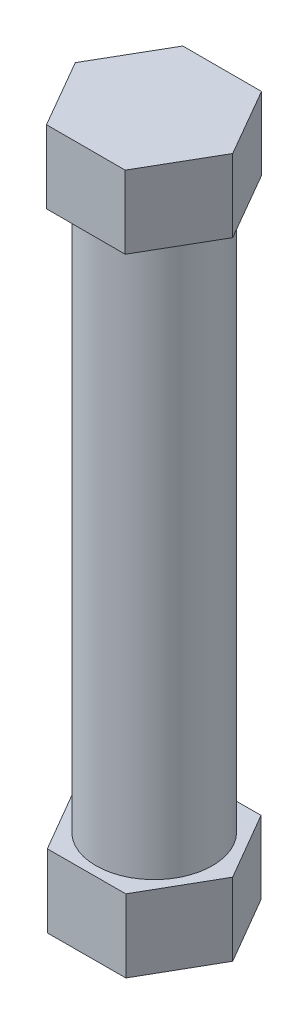
ISO-10303-21;
HEADER;
FILE_DESCRIPTION(('STEP AP214'),'2;1');
FILE_NAME('part.step','',(''),(''),'','','');
FILE_SCHEMA(('AUTOMOTIVE_DESIGN { 1 0 10303 214 1 1 1 1 }'));
ENDSEC;
DATA;
#1=APPLICATION_CONTEXT('core data for automotive mechanical design processes');
#2=APPLICATION_PROTOCOL_DEFINITION('international standard','automotive_design',2000,#1);
#3=PRODUCT_CONTEXT('',#1,'mechanical');
#4=PRODUCT('Part','Part','',(#3));
#5=PRODUCT_RELATED_PRODUCT_CATEGORY('part','',(#4));
#6=PRODUCT_DEFINITION_FORMATION('','',#4);
#7=PRODUCT_DEFINITION_CONTEXT('part definition',#1,'design');
#8=PRODUCT_DEFINITION('design','',#6,#7);
#9=PRODUCT_DEFINITION_SHAPE('','',#8);
#10=(LENGTH_UNIT() NAMED_UNIT(*) SI_UNIT(.MILLI.,.METRE.));
#11=(NAMED_UNIT(*) PLANE_ANGLE_UNIT() SI_UNIT($,.RADIAN.));
#12=(NAMED_UNIT(*) SI_UNIT($,.STERADIAN.) SOLID_ANGLE_UNIT());
#13=UNCERTAINTY_MEASURE_WITH_UNIT(LENGTH_MEASURE(1.E-05),#10,'distance_accuracy_value','');
#14=(GEOMETRIC_REPRESENTATION_CONTEXT(3) GLOBAL_UNCERTAINTY_ASSIGNED_CONTEXT((#13)) GLOBAL_UNIT_ASSIGNED_CONTEXT((#10,
#11,#12)) REPRESENTATION_CONTEXT('',''));
#15=CARTESIAN_POINT('',(0.,0.,0.));
#16=DIRECTION('',(0.,0.,1.));
#17=DIRECTION('',(1.,0.,0.));
#18=AXIS2_PLACEMENT_3D('',#15,#16,#17);
#19=CARTESIAN_POINT('',(0.,38.,0.));
#20=DIRECTION('',(0.,-1.,0.));
#21=DIRECTION('',(0.,0.,-1.));
#22=AXIS2_PLACEMENT_3D('',#19,#20,#21);
#23=CYLINDRICAL_SURFACE('',#22,4.);
#24=CARTESIAN_POINT('',(0.,38.,0.));
#25=DIRECTION('',(0.,1.,0.));
#26=DIRECTION('',(0.,0.,1.));
#27=AXIS2_PLACEMENT_3D('',#24,#25,#26);
#28=CIRCLE('',#27,4.);
#29=CARTESIAN_POINT('',(0.,38.,4.));
#30=VERTEX_POINT('',#29);
#31=EDGE_CURVE('E11',#30,#30,#28,.T.);
#32=ORIENTED_EDGE('',*,*,#31,.F.);
#33=EDGE_LOOP('',(#32));
#34=FACE_BOUND('',#33,.T.);
#35=CARTESIAN_POINT('',(0.,0.,0.));
#36=DIRECTION('',(0.,1.,0.));
#37=DIRECTION('',(0.,0.,1.));
#38=AXIS2_PLACEMENT_3D('',#35,#36,#37);
#39=CIRCLE('',#38,4.);
#40=CARTESIAN_POINT('',(0.,0.,4.));
#41=VERTEX_POINT('',#40);
#42=EDGE_CURVE('E43',#41,#41,#39,.T.);
#43=ORIENTED_EDGE('',*,*,#42,.T.);
#44=EDGE_LOOP('',(#43));
#45=FACE_BOUND('',#44,.T.);
#46=ADVANCED_FACE('F40',(#34,#45),#23,.T.);
#47=CARTESIAN_POINT('',(2.67187828013835,43.,4.66030109790377));
#48=DIRECTION('',(-0.866025403784439,0.,-0.5));
#49=DIRECTION('',(-0.5,0.,0.866025403784439));
#50=AXIS2_PLACEMENT_3D('',#47,#48,#49);
#51=PLANE('',#50);
#52=DIRECTION('',(0.5,0.,-0.866025403784439));
#53=VECTOR('',#52,1.);
#54=CARTESIAN_POINT('',(2.67187828013835,38.,4.66030109790377));
#55=LINE('',#54,#53);
#56=CARTESIAN_POINT('',(2.67187828013835,38.,4.66030109790377));
#57=VERTEX_POINT('',#56);
#58=CARTESIAN_POINT('',(5.37187828013835,38.,-0.0162360825321957));
#59=VERTEX_POINT('',#58);
#60=EDGE_CURVE('E130',#57,#59,#55,.T.);
#61=ORIENTED_EDGE('',*,*,#60,.T.);
#62=DIRECTION('',(0.,-1.,0.));
#63=VECTOR('',#62,1.);
#64=CARTESIAN_POINT('',(5.37187828013835,43.,-0.0162360825321957));
#65=LINE('',#64,#63);
#66=CARTESIAN_POINT('',(5.37187828013835,43.,-0.0162360825321957));
#67=VERTEX_POINT('',#66);
#68=EDGE_CURVE('E49',#67,#59,#65,.T.);
#69=ORIENTED_EDGE('',*,*,#68,.F.);
#70=DIRECTION('',(0.5,0.,-0.866025403784439));
#71=VECTOR('',#70,1.);
#72=CARTESIAN_POINT('',(2.67187828013835,43.,4.66030109790377));
#73=LINE('',#72,#71);
#74=CARTESIAN_POINT('',(2.67187828013835,43.,4.66030109790377));
#75=VERTEX_POINT('',#74);
#76=EDGE_CURVE('E140',#75,#67,#73,.T.);
#77=ORIENTED_EDGE('',*,*,#76,.F.);
#78=DIRECTION('',(0.,-1.,0.));
#79=VECTOR('',#78,1.);
#80=CARTESIAN_POINT('',(2.67187828013835,43.,4.66030109790377));
#81=LINE('',#80,#79);
#82=EDGE_CURVE('E126',#75,#57,#81,.T.);
#83=ORIENTED_EDGE('',*,*,#82,.T.);
#84=EDGE_LOOP('',(#61,#69,#77,#83));
#85=FACE_BOUND('',#84,.T.);
#86=ADVANCED_FACE('F152',(#85),#51,.F.);
#87=CARTESIAN_POINT('',(5.37187828013835,43.,-0.0162360825321957));
#88=DIRECTION('',(-0.866025403784439,0.,0.5));
#89=DIRECTION('',(0.5,0.,0.866025403784439));
#90=AXIS2_PLACEMENT_3D('',#87,#88,#89);
#91=PLANE('',#90);
#92=DIRECTION('',(-0.5,0.,-0.866025403784439));
#93=VECTOR('',#92,1.);
#94=CARTESIAN_POINT('',(5.37187828013835,38.,-0.0162360825321957));
#95=LINE('',#94,#93);
#96=CARTESIAN_POINT('',(2.67187828013836,38.,-4.69277326296816));
#97=VERTEX_POINT('',#96);
#98=EDGE_CURVE('E133',#59,#97,#95,.T.);
#99=ORIENTED_EDGE('',*,*,#98,.T.);
#100=DIRECTION('',(0.,-1.,0.));
#101=VECTOR('',#100,1.);
#102=CARTESIAN_POINT('',(2.67187828013836,43.,-4.69277326296816));
#103=LINE('',#102,#101);
#104=CARTESIAN_POINT('',(2.67187828013836,43.,-4.69277326296816));
#105=VERTEX_POINT('',#104);
#106=EDGE_CURVE('E144',#105,#97,#103,.T.);
#107=ORIENTED_EDGE('',*,*,#106,.F.);
#108=DIRECTION('',(-0.5,0.,-0.866025403784439));
#109=VECTOR('',#108,1.);
#110=CARTESIAN_POINT('',(5.37187828013835,43.,-0.0162360825321957));
#111=LINE('',#110,#109);
#112=EDGE_CURVE('E96',#67,#105,#111,.T.);
#113=ORIENTED_EDGE('',*,*,#112,.F.);
#114=ORIENTED_EDGE('',*,*,#68,.T.);
#115=EDGE_LOOP('',(#99,#107,#113,#114));
#116=FACE_BOUND('',#115,.T.);
#117=ADVANCED_FACE('F148',(#116),#91,.F.);
#118=CARTESIAN_POINT('',(2.67187828013836,43.,-4.69277326296816));
#119=DIRECTION('',(0.,0.,1.));
#120=DIRECTION('',(1.,0.,0.));
#121=AXIS2_PLACEMENT_3D('',#118,#119,#120);
#122=PLANE('',#121);
#123=DIRECTION('',(-1.,0.,0.));
#124=VECTOR('',#123,1.);
#125=CARTESIAN_POINT('',(2.67187828013836,38.,-4.69277326296816));
#126=LINE('',#125,#124);
#127=CARTESIAN_POINT('',(-2.72812171986164,38.,-4.69277326296816));
#128=VERTEX_POINT('',#127);
#129=EDGE_CURVE('E135',#97,#128,#126,.T.);
#130=ORIENTED_EDGE('',*,*,#129,.T.);
#131=DIRECTION('',(0.,-1.,0.));
#132=VECTOR('',#131,1.);
#133=CARTESIAN_POINT('',(-2.72812171986164,43.,-4.69277326296816));
#134=LINE('',#133,#132);
#135=CARTESIAN_POINT('',(-2.72812171986164,43.,-4.69277326296816));
#136=VERTEX_POINT('',#135);
#137=EDGE_CURVE('E121',#136,#128,#134,.T.);
#138=ORIENTED_EDGE('',*,*,#137,.F.);
#139=DIRECTION('',(-1.,0.,0.));
#140=VECTOR('',#139,1.);
#141=CARTESIAN_POINT('',(2.67187828013836,43.,-4.69277326296816));
#142=LINE('',#141,#140);
#143=EDGE_CURVE('E112',#105,#136,#142,.T.);
#144=ORIENTED_EDGE('',*,*,#143,.F.);
#145=ORIENTED_EDGE('',*,*,#106,.T.);
#146=EDGE_LOOP('',(#130,#138,#144,#145));
#147=FACE_BOUND('',#146,.T.);
#148=ADVANCED_FACE('F157',(#147),#122,.F.);
#149=CARTESIAN_POINT('',(-2.72812171986164,43.,-4.69277326296816));
#150=DIRECTION('',(0.866025403784439,0.,0.5));
#151=DIRECTION('',(0.5,0.,-0.866025403784439));
#152=AXIS2_PLACEMENT_3D('',#149,#150,#151);
#153=PLANE('',#152);
#154=DIRECTION('',(-0.5,0.,0.866025403784439));
#155=VECTOR('',#154,1.);
#156=CARTESIAN_POINT('',(-2.72812171986164,38.,-4.69277326296816));
#157=LINE('',#156,#155);
#158=CARTESIAN_POINT('',(-5.42812171986164,38.,-0.0162360825321966));
#159=VERTEX_POINT('',#158);
#160=EDGE_CURVE('E120',#128,#159,#157,.T.);
#161=ORIENTED_EDGE('',*,*,#160,.T.);
#162=DIRECTION('',(0.,-1.,0.));
#163=VECTOR('',#162,1.);
#164=CARTESIAN_POINT('',(-5.42812171986164,43.,-0.0162360825321966));
#165=LINE('',#164,#163);
#166=CARTESIAN_POINT('',(-5.42812171986164,43.,-0.0162360825321966));
#167=VERTEX_POINT('',#166);
#168=EDGE_CURVE('E117',#167,#159,#165,.T.);
#169=ORIENTED_EDGE('',*,*,#168,.F.);
#170=DIRECTION('',(-0.5,0.,0.866025403784439));
#171=VECTOR('',#170,1.);
#172=CARTESIAN_POINT('',(-2.72812171986164,43.,-4.69277326296816));
#173=LINE('',#172,#171);
#174=EDGE_CURVE('E106',#136,#167,#173,.T.);
#175=ORIENTED_EDGE('',*,*,#174,.F.);
#176=ORIENTED_EDGE('',*,*,#137,.T.);
#177=EDGE_LOOP('',(#161,#169,#175,#176));
#178=FACE_BOUND('',#177,.T.);
#179=ADVANCED_FACE('F118',(#178),#153,.F.);
#180=CARTESIAN_POINT('',(-5.42812171986164,43.,-0.0162360825321966));
#181=DIRECTION('',(0.866025403784439,0.,-0.5));
#182=DIRECTION('',(-0.5,0.,-0.866025403784439));
#183=AXIS2_PLACEMENT_3D('',#180,#181,#182);
#184=PLANE('',#183);
#185=DIRECTION('',(0.5,0.,0.866025403784439));
#186=VECTOR('',#185,1.);
#187=CARTESIAN_POINT('',(-5.42812171986164,38.,-0.0162360825321966));
#188=LINE('',#187,#186);
#189=CARTESIAN_POINT('',(-2.72812171986164,38.,4.66030109790377));
#190=VERTEX_POINT('',#189);
#191=EDGE_CURVE('E81',#159,#190,#188,.T.);
#192=ORIENTED_EDGE('',*,*,#191,.T.);
#193=DIRECTION('',(0.,-1.,0.));
#194=VECTOR('',#193,1.);
#195=CARTESIAN_POINT('',(-2.72812171986164,43.,4.66030109790377));
#196=LINE('',#195,#194);
#197=CARTESIAN_POINT('',(-2.72812171986164,43.,4.66030109790377));
#198=VERTEX_POINT('',#197);
#199=EDGE_CURVE('E122',#198,#190,#196,.T.);
#200=ORIENTED_EDGE('',*,*,#199,.F.);
#201=DIRECTION('',(0.5,0.,0.866025403784439));
#202=VECTOR('',#201,1.);
#203=CARTESIAN_POINT('',(-5.42812171986164,43.,-0.0162360825321966));
#204=LINE('',#203,#202);
#205=EDGE_CURVE('E110',#167,#198,#204,.T.);
#206=ORIENTED_EDGE('',*,*,#205,.F.);
#207=ORIENTED_EDGE('',*,*,#168,.T.);
#208=EDGE_LOOP('',(#192,#200,#206,#207));
#209=FACE_BOUND('',#208,.T.);
#210=ADVANCED_FACE('F124',(#209),#184,.F.);
#211=CARTESIAN_POINT('',(-2.72812171986164,43.,4.66030109790377));
#212=DIRECTION('',(0.,0.,-1.));
#213=DIRECTION('',(-1.,0.,0.));
#214=AXIS2_PLACEMENT_3D('',#211,#212,#213);
#215=PLANE('',#214);
#216=DIRECTION('',(1.,0.,0.));
#217=VECTOR('',#216,1.);
#218=CARTESIAN_POINT('',(-2.72812171986164,38.,4.66030109790377));
#219=LINE('',#218,#217);
#220=EDGE_CURVE('E87',#190,#57,#219,.T.);
#221=ORIENTED_EDGE('',*,*,#220,.T.);
#222=ORIENTED_EDGE('',*,*,#82,.F.);
#223=DIRECTION('',(1.,0.,0.));
#224=VECTOR('',#223,1.);
#225=CARTESIAN_POINT('',(-2.72812171986164,43.,4.66030109790377));
#226=LINE('',#225,#224);
#227=EDGE_CURVE('E57',#198,#75,#226,.T.);
#228=ORIENTED_EDGE('',*,*,#227,.F.);
#229=ORIENTED_EDGE('',*,*,#199,.T.);
#230=EDGE_LOOP('',(#221,#222,#228,#229));
#231=FACE_BOUND('',#230,.T.);
#232=ADVANCED_FACE('F276',(#231),#215,.F.);
#233=CARTESIAN_POINT('',(0.,43.,0.));
#234=DIRECTION('',(0.,1.,0.));
#235=DIRECTION('',(0.,0.,1.));
#236=AXIS2_PLACEMENT_3D('',#233,#234,#235);
#237=PLANE('',#236);
#238=ORIENTED_EDGE('',*,*,#76,.T.);
#239=ORIENTED_EDGE('',*,*,#112,.T.);
#240=ORIENTED_EDGE('',*,*,#143,.T.);
#241=ORIENTED_EDGE('',*,*,#174,.T.);
#242=ORIENTED_EDGE('',*,*,#205,.T.);
#243=ORIENTED_EDGE('',*,*,#227,.T.);
#244=EDGE_LOOP('',(#238,#239,#240,#241,#242,#243));
#245=FACE_BOUND('',#244,.T.);
#246=ADVANCED_FACE('F108',(#245),#237,.T.);
#247=CARTESIAN_POINT('',(0.,38.,0.));
#248=DIRECTION('',(0.,1.,0.));
#249=DIRECTION('',(0.,0.,1.));
#250=AXIS2_PLACEMENT_3D('',#247,#248,#249);
#251=PLANE('',#250);
#252=ORIENTED_EDGE('',*,*,#31,.T.);
#253=EDGE_LOOP('',(#252));
#254=FACE_BOUND('',#253,.T.);
#255=ORIENTED_EDGE('',*,*,#60,.F.);
#256=ORIENTED_EDGE('',*,*,#220,.F.);
#257=ORIENTED_EDGE('',*,*,#191,.F.);
#258=ORIENTED_EDGE('',*,*,#160,.F.);
#259=ORIENTED_EDGE('',*,*,#129,.F.);
#260=ORIENTED_EDGE('',*,*,#98,.F.);
#261=EDGE_LOOP('',(#255,#256,#257,#258,#259,#260));
#262=FACE_BOUND('',#261,.T.);
#263=ADVANCED_FACE('F154',(#254,#262),#251,.F.);
#264=CARTESIAN_POINT('',(2.67187828013839,-5.,-4.66030109790374));
#265=DIRECTION('',(-0.864510244180579,0.,0.502615198443935));
#266=DIRECTION('',(0.502615198443935,0.,0.864510244180579));
#267=AXIS2_PLACEMENT_3D('',#264,#265,#266);
#268=PLANE('',#267);
#269=DIRECTION('',(0.502615198443935,0.,0.864510244180579));
#270=VECTOR('',#269,1.);
#271=CARTESIAN_POINT('',(2.67187828013839,0.,-4.66030109790374));
#272=LINE('',#271,#270);
#273=CARTESIAN_POINT('',(2.67187828013839,0.,-4.66030109790374));
#274=VERTEX_POINT('',#273);
#275=CARTESIAN_POINT('',(5.37187828013835,0.,-0.0162360825321497));
#276=VERTEX_POINT('',#275);
#277=EDGE_CURVE('E196',#274,#276,#272,.T.);
#278=ORIENTED_EDGE('',*,*,#277,.T.);
#279=DIRECTION('',(0.,1.,0.));
#280=VECTOR('',#279,1.);
#281=CARTESIAN_POINT('',(5.37187828013835,-5.,-0.0162360825321497));
#282=LINE('',#281,#280);
#283=CARTESIAN_POINT('',(5.37187828013835,-5.,-0.0162360825321497));
#284=VERTEX_POINT('',#283);
#285=EDGE_CURVE('E161',#284,#276,#282,.T.);
#286=ORIENTED_EDGE('',*,*,#285,.F.);
#287=DIRECTION('',(0.502615198443935,0.,0.864510244180579));
#288=VECTOR('',#287,1.);
#289=CARTESIAN_POINT('',(2.67187828013839,-5.,-4.66030109790374));
#290=LINE('',#289,#288);
#291=CARTESIAN_POINT('',(2.67187828013839,-5.,-4.66030109790374));
#292=VERTEX_POINT('',#291);
#293=EDGE_CURVE('E183',#292,#284,#290,.T.);
#294=ORIENTED_EDGE('',*,*,#293,.F.);
#295=DIRECTION('',(0.,1.,0.));
#296=VECTOR('',#295,1.);
#297=CARTESIAN_POINT('',(2.67187828013839,-5.,-4.66030109790374));
#298=LINE('',#297,#296);
#299=EDGE_CURVE('E176',#292,#274,#298,.T.);
#300=ORIENTED_EDGE('',*,*,#299,.T.);
#301=EDGE_LOOP('',(#278,#286,#294,#300));
#302=FACE_BOUND('',#301,.T.);
#303=ADVANCED_FACE('F226',(#302),#268,.F.);
#304=CARTESIAN_POINT('',(5.37187828013835,-5.,-0.0162360825321497));
#305=DIRECTION('',(-0.867532652270894,0.,-0.497380234070302));
#306=DIRECTION('',(-0.497380234070302,0.,0.867532652270894));
#307=AXIS2_PLACEMENT_3D('',#304,#305,#306);
#308=PLANE('',#307);
#309=DIRECTION('',(-0.497380234070302,0.,0.867532652270894));
#310=VECTOR('',#309,1.);
#311=CARTESIAN_POINT('',(5.37187828013835,0.,-0.0162360825321497));
#312=LINE('',#311,#310);
#313=CARTESIAN_POINT('',(2.69999999999996,0.,4.64406501537159));
#314=VERTEX_POINT('',#313);
#315=EDGE_CURVE('E193',#276,#314,#312,.T.);
#316=ORIENTED_EDGE('',*,*,#315,.T.);
#317=DIRECTION('',(0.,1.,0.));
#318=VECTOR('',#317,1.);
#319=CARTESIAN_POINT('',(2.69999999999996,-5.,4.64406501537159));
#320=LINE('',#319,#318);
#321=CARTESIAN_POINT('',(2.69999999999996,-5.,4.64406501537159));
#322=VERTEX_POINT('',#321);
#323=EDGE_CURVE('E164',#322,#314,#320,.T.);
#324=ORIENTED_EDGE('',*,*,#323,.F.);
#325=DIRECTION('',(-0.497380234070302,0.,0.867532652270894));
#326=VECTOR('',#325,1.);
#327=CARTESIAN_POINT('',(5.37187828013835,-5.,-0.0162360825321497));
#328=LINE('',#327,#326);
#329=EDGE_CURVE('E210',#284,#322,#328,.T.);
#330=ORIENTED_EDGE('',*,*,#329,.F.);
#331=ORIENTED_EDGE('',*,*,#285,.T.);
#332=EDGE_LOOP('',(#316,#324,#330,#331));
#333=FACE_BOUND('',#332,.T.);
#334=ADVANCED_FACE('F230',(#333),#308,.F.);
#335=CARTESIAN_POINT('',(2.69999999999996,-5.,4.64406501537159));
#336=DIRECTION('',(-0.0030224080903148,0.,-0.999995432514237));
#337=DIRECTION('',(-0.999995432514237,0.,0.0030224080903148));
#338=AXIS2_PLACEMENT_3D('',#335,#336,#337);
#339=PLANE('',#338);
#340=DIRECTION('',(-0.999995432514237,0.,0.0030224080903148));
#341=VECTOR('',#340,1.);
#342=CARTESIAN_POINT('',(2.69999999999996,0.,4.64406501537159));
#343=LINE('',#342,#341);
#344=CARTESIAN_POINT('',(-2.67187828013839,0.,4.66030109790375));
#345=VERTEX_POINT('',#344);
#346=EDGE_CURVE('E190',#314,#345,#343,.T.);
#347=ORIENTED_EDGE('',*,*,#346,.T.);
#348=DIRECTION('',(0.,1.,0.));
#349=VECTOR('',#348,1.);
#350=CARTESIAN_POINT('',(-2.67187828013839,-5.,4.66030109790375));
#351=LINE('',#350,#349);
#352=CARTESIAN_POINT('',(-2.67187828013839,-5.,4.66030109790375));
#353=VERTEX_POINT('',#352);
#354=EDGE_CURVE('E167',#353,#345,#351,.T.);
#355=ORIENTED_EDGE('',*,*,#354,.F.);
#356=DIRECTION('',(-0.999995432514237,0.,0.0030224080903148));
#357=VECTOR('',#356,1.);
#358=CARTESIAN_POINT('',(2.69999999999996,-5.,4.64406501537159));
#359=LINE('',#358,#357);
#360=EDGE_CURVE('E207',#322,#353,#359,.T.);
#361=ORIENTED_EDGE('',*,*,#360,.F.);
#362=ORIENTED_EDGE('',*,*,#323,.T.);
#363=EDGE_LOOP('',(#347,#355,#361,#362));
#364=FACE_BOUND('',#363,.T.);
#365=ADVANCED_FACE('F334',(#364),#339,.F.);
#366=CARTESIAN_POINT('',(-2.67187828013839,-5.,4.66030109790375));
#367=DIRECTION('',(0.864510244180579,0.,-0.502615198443935));
#368=DIRECTION('',(-0.502615198443935,0.,-0.864510244180579));
#369=AXIS2_PLACEMENT_3D('',#366,#367,#368);
#370=PLANE('',#369);
#371=DIRECTION('',(-0.502615198443935,0.,-0.864510244180579));
#372=VECTOR('',#371,1.);
#373=CARTESIAN_POINT('',(-2.67187828013839,0.,4.66030109790375));
#374=LINE('',#373,#372);
#375=CARTESIAN_POINT('',(-5.37187828013835,0.,0.0162360825321523));
#376=VERTEX_POINT('',#375);
#377=EDGE_CURVE('E187',#345,#376,#374,.T.);
#378=ORIENTED_EDGE('',*,*,#377,.T.);
#379=DIRECTION('',(0.,1.,0.));
#380=VECTOR('',#379,1.);
#381=CARTESIAN_POINT('',(-5.37187828013835,-5.,0.0162360825321523));
#382=LINE('',#381,#380);
#383=CARTESIAN_POINT('',(-5.37187828013835,-5.,0.0162360825321523));
#384=VERTEX_POINT('',#383);
#385=EDGE_CURVE('E170',#384,#376,#382,.T.);
#386=ORIENTED_EDGE('',*,*,#385,.F.);
#387=DIRECTION('',(-0.502615198443935,0.,-0.864510244180579));
#388=VECTOR('',#387,1.);
#389=CARTESIAN_POINT('',(-2.67187828013839,-5.,4.66030109790375));
#390=LINE('',#389,#388);
#391=EDGE_CURVE('E204',#353,#384,#390,.T.);
#392=ORIENTED_EDGE('',*,*,#391,.F.);
#393=ORIENTED_EDGE('',*,*,#354,.T.);
#394=EDGE_LOOP('',(#378,#386,#392,#393));
#395=FACE_BOUND('',#394,.T.);
#396=ADVANCED_FACE('F344',(#395),#370,.F.);
#397=CARTESIAN_POINT('',(-5.37187828013835,-5.,0.0162360825321523));
#398=DIRECTION('',(0.867532652270894,0.,0.497380234070302));
#399=DIRECTION('',(0.497380234070302,0.,-0.867532652270894));
#400=AXIS2_PLACEMENT_3D('',#397,#398,#399);
#401=PLANE('',#400);
#402=DIRECTION('',(0.497380234070302,0.,-0.867532652270894));
#403=VECTOR('',#402,1.);
#404=CARTESIAN_POINT('',(-5.37187828013835,0.,0.0162360825321523));
#405=LINE('',#404,#403);
#406=CARTESIAN_POINT('',(-2.69999999999996,0.,-4.64406501537159));
#407=VERTEX_POINT('',#406);
#408=EDGE_CURVE('E184',#376,#407,#405,.T.);
#409=ORIENTED_EDGE('',*,*,#408,.T.);
#410=DIRECTION('',(0.,1.,0.));
#411=VECTOR('',#410,1.);
#412=CARTESIAN_POINT('',(-2.69999999999996,-5.,-4.64406501537159));
#413=LINE('',#412,#411);
#414=CARTESIAN_POINT('',(-2.69999999999996,-5.,-4.64406501537159));
#415=VERTEX_POINT('',#414);
#416=EDGE_CURVE('E173',#415,#407,#413,.T.);
#417=ORIENTED_EDGE('',*,*,#416,.F.);
#418=DIRECTION('',(0.497380234070302,0.,-0.867532652270894));
#419=VECTOR('',#418,1.);
#420=CARTESIAN_POINT('',(-5.37187828013835,-5.,0.0162360825321523));
#421=LINE('',#420,#419);
#422=EDGE_CURVE('E201',#384,#415,#421,.T.);
#423=ORIENTED_EDGE('',*,*,#422,.F.);
#424=ORIENTED_EDGE('',*,*,#385,.T.);
#425=EDGE_LOOP('',(#409,#417,#423,#424));
#426=FACE_BOUND('',#425,.T.);
#427=ADVANCED_FACE('F355',(#426),#401,.F.);
#428=CARTESIAN_POINT('',(-2.69999999999996,-5.,-4.64406501537159));
#429=DIRECTION('',(0.00302240809031432,0.,0.999995432514237));
#430=DIRECTION('',(0.999995432514237,0.,-0.00302240809031432));
#431=AXIS2_PLACEMENT_3D('',#428,#429,#430);
#432=PLANE('',#431);
#433=DIRECTION('',(0.999995432514237,0.,-0.00302240809031432));
#434=VECTOR('',#433,1.);
#435=CARTESIAN_POINT('',(-2.69999999999996,0.,-4.64406501537159));
#436=LINE('',#435,#434);
#437=EDGE_CURVE('E180',#407,#274,#436,.T.);
#438=ORIENTED_EDGE('',*,*,#437,.T.);
#439=ORIENTED_EDGE('',*,*,#299,.F.);
#440=DIRECTION('',(0.999995432514237,0.,-0.00302240809031432));
#441=VECTOR('',#440,1.);
#442=CARTESIAN_POINT('',(-2.69999999999996,-5.,-4.64406501537159));
#443=LINE('',#442,#441);
#444=EDGE_CURVE('E179',#415,#292,#443,.T.);
#445=ORIENTED_EDGE('',*,*,#444,.F.);
#446=ORIENTED_EDGE('',*,*,#416,.T.);
#447=EDGE_LOOP('',(#438,#439,#445,#446));
#448=FACE_BOUND('',#447,.T.);
#449=ADVANCED_FACE('F249',(#448),#432,.F.);
#450=CARTESIAN_POINT('',(0.,-5.,0.));
#451=DIRECTION('',(0.,-1.,0.));
#452=DIRECTION('',(0.,0.,-1.));
#453=AXIS2_PLACEMENT_3D('',#450,#451,#452);
#454=PLANE('',#453);
#455=ORIENTED_EDGE('',*,*,#293,.T.);
#456=ORIENTED_EDGE('',*,*,#329,.T.);
#457=ORIENTED_EDGE('',*,*,#360,.T.);
#458=ORIENTED_EDGE('',*,*,#391,.T.);
#459=ORIENTED_EDGE('',*,*,#422,.T.);
#460=ORIENTED_EDGE('',*,*,#444,.T.);
#461=EDGE_LOOP('',(#455,#456,#457,#458,#459,#460));
#462=FACE_BOUND('',#461,.T.);
#463=ADVANCED_FACE('F218',(#462),#454,.T.);
#464=CARTESIAN_POINT('',(0.,0.,0.));
#465=DIRECTION('',(0.,-1.,0.));
#466=DIRECTION('',(0.,0.,-1.));
#467=AXIS2_PLACEMENT_3D('',#464,#465,#466);
#468=PLANE('',#467);
#469=ORIENTED_EDGE('',*,*,#42,.F.);
#470=EDGE_LOOP('',(#469));
#471=FACE_BOUND('',#470,.T.);
#472=ORIENTED_EDGE('',*,*,#277,.F.);
#473=ORIENTED_EDGE('',*,*,#437,.F.);
#474=ORIENTED_EDGE('',*,*,#408,.F.);
#475=ORIENTED_EDGE('',*,*,#377,.F.);
#476=ORIENTED_EDGE('',*,*,#346,.F.);
#477=ORIENTED_EDGE('',*,*,#315,.F.);
#478=EDGE_LOOP('',(#472,#473,#474,#475,#476,#477));
#479=FACE_BOUND('',#478,.T.);
#480=ADVANCED_FACE('F250',(#471,#479),#468,.F.);
#481=CLOSED_SHELL('',(#46,#86,#117,#148,#179,#210,#232,#246,#263,#303,#334,#365,#396,#427,#449,
#463,#480));
#482=MANIFOLD_SOLID_BREP('B2',#481);
#483=ADVANCED_BREP_SHAPE_REPRESENTATION('',(#18,#482),#14);
#484=SHAPE_DEFINITION_REPRESENTATION(#9,#483);
ENDSEC;
END-ISO-10303-21;
